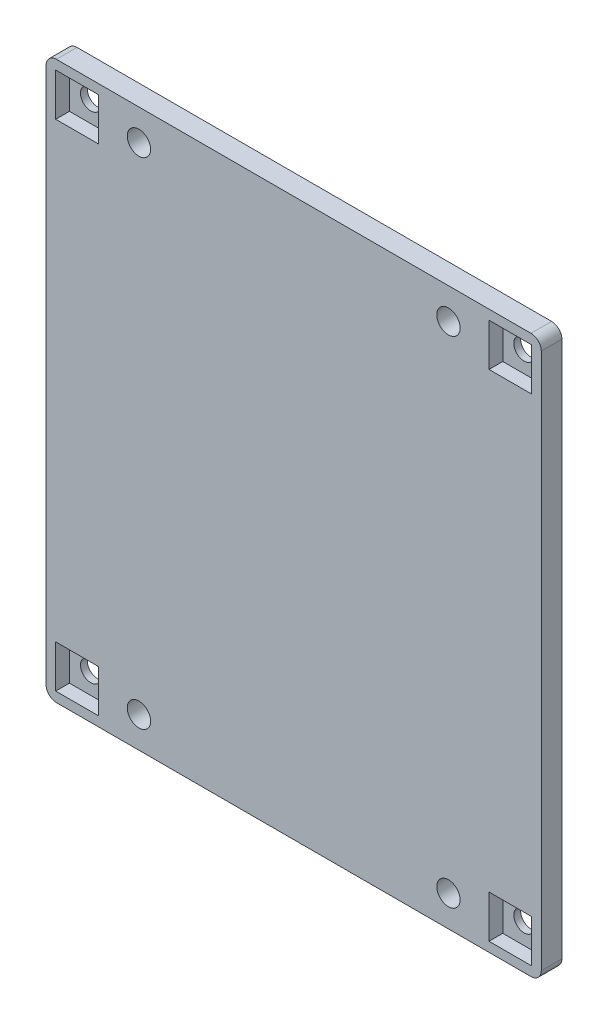
ISO-10303-21;
HEADER;
FILE_DESCRIPTION(('STEP AP214'),'2;1');
FILE_NAME('part.step','',(''),(''),'','','');
FILE_SCHEMA(('AUTOMOTIVE_DESIGN { 1 0 10303 214 1 1 1 1 }'));
ENDSEC;
DATA;
#1=APPLICATION_CONTEXT('core data for automotive mechanical design processes');
#2=APPLICATION_PROTOCOL_DEFINITION('international standard','automotive_design',2000,#1);
#3=PRODUCT_CONTEXT('',#1,'mechanical');
#4=PRODUCT('Part','Part','',(#3));
#5=PRODUCT_RELATED_PRODUCT_CATEGORY('part','',(#4));
#6=PRODUCT_DEFINITION_FORMATION('','',#4);
#7=PRODUCT_DEFINITION_CONTEXT('part definition',#1,'design');
#8=PRODUCT_DEFINITION('design','',#6,#7);
#9=PRODUCT_DEFINITION_SHAPE('','',#8);
#10=(LENGTH_UNIT() NAMED_UNIT(*) SI_UNIT(.MILLI.,.METRE.));
#11=(NAMED_UNIT(*) PLANE_ANGLE_UNIT() SI_UNIT($,.RADIAN.));
#12=(NAMED_UNIT(*) SI_UNIT($,.STERADIAN.) SOLID_ANGLE_UNIT());
#13=UNCERTAINTY_MEASURE_WITH_UNIT(LENGTH_MEASURE(1.E-05),#10,'distance_accuracy_value','');
#14=(GEOMETRIC_REPRESENTATION_CONTEXT(3) GLOBAL_UNCERTAINTY_ASSIGNED_CONTEXT((#13)) GLOBAL_UNIT_ASSIGNED_CONTEXT((#10,
#11,#12)) REPRESENTATION_CONTEXT('',''));
#15=CARTESIAN_POINT('',(0.,0.,0.));
#16=DIRECTION('',(0.,0.,1.));
#17=DIRECTION('',(1.,0.,0.));
#18=AXIS2_PLACEMENT_3D('',#15,#16,#17);
#19=CARTESIAN_POINT('',(73.690098203,224.4095935041,3.));
#20=DIRECTION('',(0.,0.,-1.));
#21=DIRECTION('',(-1.,0.,0.));
#22=AXIS2_PLACEMENT_3D('',#19,#20,#21);
#23=CYLINDRICAL_SURFACE('',#22,1.5);
#24=CARTESIAN_POINT('',(73.690098203,224.4095935041,0.));
#25=DIRECTION('',(0.,0.,1.));
#26=DIRECTION('',(1.,0.,0.));
#27=AXIS2_PLACEMENT_3D('',#24,#25,#26);
#28=CIRCLE('',#27,1.5);
#29=CARTESIAN_POINT('',(75.190098203,224.4095935041,0.));
#30=VERTEX_POINT('',#29);
#31=EDGE_CURVE('E364',#30,#30,#28,.T.);
#32=ORIENTED_EDGE('',*,*,#31,.F.);
#33=EDGE_LOOP('',(#32));
#34=FACE_BOUND('',#33,.T.);
#35=CARTESIAN_POINT('',(73.690098203,224.4095935041,1.));
#36=DIRECTION('',(0.,0.,1.));
#37=DIRECTION('',(1.,0.,0.));
#38=AXIS2_PLACEMENT_3D('',#35,#36,#37);
#39=CIRCLE('',#38,1.5);
#40=CARTESIAN_POINT('',(75.190098203,224.4095935041,1.));
#41=VERTEX_POINT('',#40);
#42=EDGE_CURVE('E259',#41,#41,#39,.T.);
#43=ORIENTED_EDGE('',*,*,#42,.T.);
#44=EDGE_LOOP('',(#43));
#45=FACE_BOUND('',#44,.T.);
#46=ADVANCED_FACE('F33',(#34,#45),#23,.F.);
#47=CARTESIAN_POINT('',(73.690098203,296.4145378641,3.));
#48=DIRECTION('',(0.,0.,-1.));
#49=DIRECTION('',(-1.,0.,0.));
#50=AXIS2_PLACEMENT_3D('',#47,#48,#49);
#51=CYLINDRICAL_SURFACE('',#50,1.5);
#52=CARTESIAN_POINT('',(73.690098203,296.4145378641,0.));
#53=DIRECTION('',(0.,0.,1.));
#54=DIRECTION('',(1.,0.,0.));
#55=AXIS2_PLACEMENT_3D('',#52,#53,#54);
#56=CIRCLE('',#55,1.5);
#57=CARTESIAN_POINT('',(75.190098203,296.4145378641,0.));
#58=VERTEX_POINT('',#57);
#59=EDGE_CURVE('E353',#58,#58,#56,.T.);
#60=ORIENTED_EDGE('',*,*,#59,.F.);
#61=EDGE_LOOP('',(#60));
#62=FACE_BOUND('',#61,.T.);
#63=CARTESIAN_POINT('',(73.690098203,296.4145378641,1.));
#64=DIRECTION('',(0.,0.,1.));
#65=DIRECTION('',(1.,0.,0.));
#66=AXIS2_PLACEMENT_3D('',#63,#64,#65);
#67=CIRCLE('',#66,1.5);
#68=CARTESIAN_POINT('',(75.190098203,296.4145378641,1.));
#69=VERTEX_POINT('',#68);
#70=EDGE_CURVE('E291',#69,#69,#67,.T.);
#71=ORIENTED_EDGE('',*,*,#70,.T.);
#72=EDGE_LOOP('',(#71));
#73=FACE_BOUND('',#72,.T.);
#74=ADVANCED_FACE('F492',(#62,#73),#51,.F.);
#75=CARTESIAN_POINT('',(10.6873594666,296.4145378641,3.));
#76=DIRECTION('',(0.,0.,-1.));
#77=DIRECTION('',(-1.,0.,0.));
#78=AXIS2_PLACEMENT_3D('',#75,#76,#77);
#79=CYLINDRICAL_SURFACE('',#78,1.5);
#80=CARTESIAN_POINT('',(10.6873594666,296.4145378641,0.));
#81=DIRECTION('',(0.,0.,1.));
#82=DIRECTION('',(1.,0.,0.));
#83=AXIS2_PLACEMENT_3D('',#80,#81,#82);
#84=CIRCLE('',#83,1.5);
#85=CARTESIAN_POINT('',(12.1873594666,296.4145378641,0.));
#86=VERTEX_POINT('',#85);
#87=EDGE_CURVE('E361',#86,#86,#84,.T.);
#88=ORIENTED_EDGE('',*,*,#87,.F.);
#89=EDGE_LOOP('',(#88));
#90=FACE_BOUND('',#89,.T.);
#91=CARTESIAN_POINT('',(10.6873594666,296.4145378641,1.));
#92=DIRECTION('',(0.,0.,1.));
#93=DIRECTION('',(1.,0.,0.));
#94=AXIS2_PLACEMENT_3D('',#91,#92,#93);
#95=CIRCLE('',#94,1.5);
#96=CARTESIAN_POINT('',(12.1873594666,296.4145378641,1.));
#97=VERTEX_POINT('',#96);
#98=EDGE_CURVE('E324',#97,#97,#95,.T.);
#99=ORIENTED_EDGE('',*,*,#98,.T.);
#100=EDGE_LOOP('',(#99));
#101=FACE_BOUND('',#100,.T.);
#102=ADVANCED_FACE('F451',(#90,#101),#79,.F.);
#103=CARTESIAN_POINT('',(76.690098203,299.4145378641,3.));
#104=DIRECTION('',(0.,0.,1.));
#105=DIRECTION('',(1.,0.,0.));
#106=AXIS2_PLACEMENT_3D('',#103,#104,#105);
#107=PLANE('',#106);
#108=DIRECTION('',(0.,-1.,0.));
#109=VECTOR('',#108,1.);
#110=CARTESIAN_POINT('',(7.5873594666,227.5095935041,3.));
#111=LINE('',#110,#109);
#112=CARTESIAN_POINT('',(7.5873594666,227.5095935041,3.));
#113=VERTEX_POINT('',#112);
#114=CARTESIAN_POINT('',(7.58735946660001,221.3095935041,3.));
#115=VERTEX_POINT('',#114);
#116=EDGE_CURVE('E50',#113,#115,#111,.T.);
#117=ORIENTED_EDGE('',*,*,#116,.F.);
#118=DIRECTION('',(-1.,0.,0.));
#119=VECTOR('',#118,1.);
#120=CARTESIAN_POINT('',(13.7873594666,227.5095935041,3.));
#121=LINE('',#120,#119);
#122=CARTESIAN_POINT('',(13.7873594666,227.5095935041,3.));
#123=VERTEX_POINT('',#122);
#124=EDGE_CURVE('E216',#123,#113,#121,.T.);
#125=ORIENTED_EDGE('',*,*,#124,.F.);
#126=DIRECTION('',(0.,1.,0.));
#127=VECTOR('',#126,1.);
#128=CARTESIAN_POINT('',(13.7873594666,227.5095935041,3.));
#129=LINE('',#128,#127);
#130=CARTESIAN_POINT('',(13.7873594666,221.3095935041,3.));
#131=VERTEX_POINT('',#130);
#132=EDGE_CURVE('E219',#131,#123,#129,.T.);
#133=ORIENTED_EDGE('',*,*,#132,.F.);
#134=DIRECTION('',(1.,0.,0.));
#135=VECTOR('',#134,1.);
#136=CARTESIAN_POINT('',(13.7873594666,221.3095935041,3.));
#137=LINE('',#136,#135);
#138=EDGE_CURVE('E225',#115,#131,#137,.T.);
#139=ORIENTED_EDGE('',*,*,#138,.F.);
#140=EDGE_LOOP('',(#117,#125,#133,#139));
#141=FACE_BOUND('',#140,.T.);
#142=DIRECTION('',(0.,1.,0.));
#143=VECTOR('',#142,1.);
#144=CARTESIAN_POINT('',(76.790098203,227.5095935041,3.));
#145=LINE('',#144,#143);
#146=CARTESIAN_POINT('',(76.790098203,221.3095935041,3.));
#147=VERTEX_POINT('',#146);
#148=CARTESIAN_POINT('',(76.790098203,227.5095935041,3.));
#149=VERTEX_POINT('',#148);
#150=EDGE_CURVE('E58',#147,#149,#145,.T.);
#151=ORIENTED_EDGE('',*,*,#150,.F.);
#152=DIRECTION('',(1.,0.,0.));
#153=VECTOR('',#152,1.);
#154=CARTESIAN_POINT('',(70.590098203,221.3095935041,3.));
#155=LINE('',#154,#153);
#156=CARTESIAN_POINT('',(70.590098203,221.3095935041,3.));
#157=VERTEX_POINT('',#156);
#158=EDGE_CURVE('E238',#157,#147,#155,.T.);
#159=ORIENTED_EDGE('',*,*,#158,.F.);
#160=DIRECTION('',(0.,-1.,0.));
#161=VECTOR('',#160,1.);
#162=CARTESIAN_POINT('',(70.590098203,227.5095935041,3.));
#163=LINE('',#162,#161);
#164=CARTESIAN_POINT('',(70.590098203,227.5095935041,3.));
#165=VERTEX_POINT('',#164);
#166=EDGE_CURVE('E252',#165,#157,#163,.T.);
#167=ORIENTED_EDGE('',*,*,#166,.F.);
#168=DIRECTION('',(-1.,0.,0.));
#169=VECTOR('',#168,1.);
#170=CARTESIAN_POINT('',(70.590098203,227.5095935041,3.));
#171=LINE('',#170,#169);
#172=EDGE_CURVE('E249',#149,#165,#171,.T.);
#173=ORIENTED_EDGE('',*,*,#172,.F.);
#174=EDGE_LOOP('',(#151,#159,#167,#173));
#175=FACE_BOUND('',#174,.T.);
#176=DIRECTION('',(0.,1.,0.));
#177=VECTOR('',#176,1.);
#178=CARTESIAN_POINT('',(76.790098203,299.5145378641,3.));
#179=LINE('',#178,#177);
#180=CARTESIAN_POINT('',(76.790098203,293.3145378641,3.));
#181=VERTEX_POINT('',#180);
#182=CARTESIAN_POINT('',(76.790098203,299.5145378641,3.));
#183=VERTEX_POINT('',#182);
#184=EDGE_CURVE('E279',#181,#183,#179,.T.);
#185=ORIENTED_EDGE('',*,*,#184,.F.);
#186=DIRECTION('',(1.,0.,0.));
#187=VECTOR('',#186,1.);
#188=CARTESIAN_POINT('',(70.590098203,293.3145378641,3.));
#189=LINE('',#188,#187);
#190=CARTESIAN_POINT('',(70.590098203,293.3145378641,3.));
#191=VERTEX_POINT('',#190);
#192=EDGE_CURVE('E269',#191,#181,#189,.T.);
#193=ORIENTED_EDGE('',*,*,#192,.F.);
#194=DIRECTION('',(0.,-1.,0.));
#195=VECTOR('',#194,1.);
#196=CARTESIAN_POINT('',(70.590098203,299.5145378641,3.));
#197=LINE('',#196,#195);
#198=CARTESIAN_POINT('',(70.590098203,299.5145378641,3.));
#199=VERTEX_POINT('',#198);
#200=EDGE_CURVE('E284',#199,#191,#197,.T.);
#201=ORIENTED_EDGE('',*,*,#200,.F.);
#202=DIRECTION('',(-1.,0.,0.));
#203=VECTOR('',#202,1.);
#204=CARTESIAN_POINT('',(70.590098203,299.5145378641,3.));
#205=LINE('',#204,#203);
#206=EDGE_CURVE('E281',#183,#199,#205,.T.);
#207=ORIENTED_EDGE('',*,*,#206,.F.);
#208=EDGE_LOOP('',(#185,#193,#201,#207));
#209=FACE_BOUND('',#208,.T.);
#210=DIRECTION('',(0.,1.,0.));
#211=VECTOR('',#210,1.);
#212=CARTESIAN_POINT('',(13.7873594666,299.5145378641,3.));
#213=LINE('',#212,#211);
#214=CARTESIAN_POINT('',(13.7873594666,293.3145378641,3.));
#215=VERTEX_POINT('',#214);
#216=CARTESIAN_POINT('',(13.7873594666,299.5145378641,3.));
#217=VERTEX_POINT('',#216);
#218=EDGE_CURVE('E312',#215,#217,#213,.T.);
#219=ORIENTED_EDGE('',*,*,#218,.F.);
#220=DIRECTION('',(1.,0.,0.));
#221=VECTOR('',#220,1.);
#222=CARTESIAN_POINT('',(7.58735946660001,293.3145378641,3.));
#223=LINE('',#222,#221);
#224=CARTESIAN_POINT('',(7.58735946660001,293.3145378641,3.));
#225=VERTEX_POINT('',#224);
#226=EDGE_CURVE('E302',#225,#215,#223,.T.);
#227=ORIENTED_EDGE('',*,*,#226,.F.);
#228=DIRECTION('',(0.,-1.,0.));
#229=VECTOR('',#228,1.);
#230=CARTESIAN_POINT('',(7.58735946660001,299.5145378641,3.));
#231=LINE('',#230,#229);
#232=CARTESIAN_POINT('',(7.58735946660001,299.5145378641,3.));
#233=VERTEX_POINT('',#232);
#234=EDGE_CURVE('E317',#233,#225,#231,.T.);
#235=ORIENTED_EDGE('',*,*,#234,.F.);
#236=DIRECTION('',(-1.,0.,0.));
#237=VECTOR('',#236,1.);
#238=CARTESIAN_POINT('',(7.58735946660001,299.5145378641,3.));
#239=LINE('',#238,#237);
#240=EDGE_CURVE('E314',#217,#233,#239,.T.);
#241=ORIENTED_EDGE('',*,*,#240,.F.);
#242=EDGE_LOOP('',(#219,#227,#235,#241));
#243=FACE_BOUND('',#242,.T.);
#244=CARTESIAN_POINT('',(19.6870249644,224.4095935041,3.));
#245=DIRECTION('',(0.,0.,1.));
#246=DIRECTION('',(1.,0.,0.));
#247=AXIS2_PLACEMENT_3D('',#244,#245,#246);
#248=CIRCLE('',#247,1.7);
#249=CARTESIAN_POINT('',(21.3870249644,224.4095935041,3.));
#250=VERTEX_POINT('',#249);
#251=EDGE_CURVE('E338',#250,#250,#248,.T.);
#252=ORIENTED_EDGE('',*,*,#251,.F.);
#253=EDGE_LOOP('',(#252));
#254=FACE_BOUND('',#253,.T.);
#255=CARTESIAN_POINT('',(19.6870249644,296.4145378641,3.));
#256=DIRECTION('',(0.,0.,1.));
#257=DIRECTION('',(1.,0.,0.));
#258=AXIS2_PLACEMENT_3D('',#255,#256,#257);
#259=CIRCLE('',#258,1.7);
#260=CARTESIAN_POINT('',(21.3870249644,296.4145378641,3.));
#261=VERTEX_POINT('',#260);
#262=EDGE_CURVE('E350',#261,#261,#259,.T.);
#263=ORIENTED_EDGE('',*,*,#262,.F.);
#264=EDGE_LOOP('',(#263));
#265=FACE_BOUND('',#264,.T.);
#266=CARTESIAN_POINT('',(76.690098203,299.4145378641,3.));
#267=DIRECTION('',(0.,0.,1.));
#268=DIRECTION('',(1.,0.,0.));
#269=AXIS2_PLACEMENT_3D('',#266,#267,#268);
#270=CIRCLE('',#269,1.5);
#271=CARTESIAN_POINT('',(78.190098203,299.4145378641,3.));
#272=VERTEX_POINT('',#271);
#273=CARTESIAN_POINT('',(76.690098203,300.9145378641,3.));
#274=VERTEX_POINT('',#273);
#275=EDGE_CURVE('E368',#272,#274,#270,.T.);
#276=ORIENTED_EDGE('',*,*,#275,.T.);
#277=DIRECTION('',(-1.,0.,0.));
#278=VECTOR('',#277,1.);
#279=CARTESIAN_POINT('',(7.6876939687,300.9145378641,3.));
#280=LINE('',#279,#278);
#281=CARTESIAN_POINT('',(7.6876939687,300.9145378641,3.));
#282=VERTEX_POINT('',#281);
#283=EDGE_CURVE('E371',#274,#282,#280,.T.);
#284=ORIENTED_EDGE('',*,*,#283,.T.);
#285=CARTESIAN_POINT('',(7.6876939687,299.4145378641,3.));
#286=DIRECTION('',(0.,0.,1.));
#287=DIRECTION('',(1.,0.,0.));
#288=AXIS2_PLACEMENT_3D('',#285,#286,#287);
#289=CIRCLE('',#288,1.5);
#290=CARTESIAN_POINT('',(6.1876939687,299.4145378641,3.));
#291=VERTEX_POINT('',#290);
#292=EDGE_CURVE('E374',#282,#291,#289,.T.);
#293=ORIENTED_EDGE('',*,*,#292,.T.);
#294=DIRECTION('',(0.,-1.,0.));
#295=VECTOR('',#294,1.);
#296=CARTESIAN_POINT('',(6.1876939687,221.4099280063,3.));
#297=LINE('',#296,#295);
#298=CARTESIAN_POINT('',(6.1876939687,221.4099280063,3.));
#299=VERTEX_POINT('',#298);
#300=EDGE_CURVE('E376',#291,#299,#297,.T.);
#301=ORIENTED_EDGE('',*,*,#300,.T.);
#302=CARTESIAN_POINT('',(7.6876939687,221.4099280063,3.));
#303=DIRECTION('',(0.,0.,1.));
#304=DIRECTION('',(1.,0.,0.));
#305=AXIS2_PLACEMENT_3D('',#302,#303,#304);
#306=CIRCLE('',#305,1.5);
#307=CARTESIAN_POINT('',(7.6876939687,219.9099280063,3.));
#308=VERTEX_POINT('',#307);
#309=EDGE_CURVE('E378',#299,#308,#306,.T.);
#310=ORIENTED_EDGE('',*,*,#309,.T.);
#311=DIRECTION('',(1.,0.,0.));
#312=VECTOR('',#311,1.);
#313=CARTESIAN_POINT('',(76.690098203,219.9099280063,3.));
#314=LINE('',#313,#312);
#315=CARTESIAN_POINT('',(76.690098203,219.9099280063,3.));
#316=VERTEX_POINT('',#315);
#317=EDGE_CURVE('E380',#308,#316,#314,.T.);
#318=ORIENTED_EDGE('',*,*,#317,.T.);
#319=CARTESIAN_POINT('',(76.690098203,221.4099280063,3.));
#320=DIRECTION('',(0.,0.,1.));
#321=DIRECTION('',(1.,0.,0.));
#322=AXIS2_PLACEMENT_3D('',#319,#320,#321);
#323=CIRCLE('',#322,1.5);
#324=CARTESIAN_POINT('',(78.190098203,221.4099280063,3.));
#325=VERTEX_POINT('',#324);
#326=EDGE_CURVE('E382',#316,#325,#323,.T.);
#327=ORIENTED_EDGE('',*,*,#326,.T.);
#328=DIRECTION('',(0.,1.,0.));
#329=VECTOR('',#328,1.);
#330=CARTESIAN_POINT('',(78.190098203,299.4145378641,3.));
#331=LINE('',#330,#329);
#332=EDGE_CURVE('E384',#325,#272,#331,.T.);
#333=ORIENTED_EDGE('',*,*,#332,.T.);
#334=EDGE_LOOP('',(#276,#284,#293,#301,#310,#318,#327,#333));
#335=FACE_BOUND('',#334,.T.);
#336=CARTESIAN_POINT('',(64.6904327051,296.4145378641,3.));
#337=DIRECTION('',(0.,0.,1.));
#338=DIRECTION('',(1.,0.,0.));
#339=AXIS2_PLACEMENT_3D('',#336,#337,#338);
#340=CIRCLE('',#339,1.69999999999999);
#341=CARTESIAN_POINT('',(66.3904327051,296.4145378641,3.));
#342=VERTEX_POINT('',#341);
#343=EDGE_CURVE('E344',#342,#342,#340,.T.);
#344=ORIENTED_EDGE('',*,*,#343,.F.);
#345=EDGE_LOOP('',(#344));
#346=FACE_BOUND('',#345,.T.);
#347=CARTESIAN_POINT('',(64.6904327051,224.4095935041,3.));
#348=DIRECTION('',(0.,0.,1.));
#349=DIRECTION('',(1.,0.,0.));
#350=AXIS2_PLACEMENT_3D('',#347,#348,#349);
#351=CIRCLE('',#350,1.69999999999999);
#352=CARTESIAN_POINT('',(66.3904327051,224.4095935041,3.));
#353=VERTEX_POINT('',#352);
#354=EDGE_CURVE('E331',#353,#353,#351,.T.);
#355=ORIENTED_EDGE('',*,*,#354,.F.);
#356=EDGE_LOOP('',(#355));
#357=FACE_BOUND('',#356,.T.);
#358=ADVANCED_FACE('F447',(#141,#175,#209,#243,#254,#265,#335,#346,#357),#107,.T.);
#359=CARTESIAN_POINT('',(76.690098203,299.4145378641,0.));
#360=DIRECTION('',(0.,0.,1.));
#361=DIRECTION('',(1.,0.,0.));
#362=AXIS2_PLACEMENT_3D('',#359,#360,#361);
#363=PLANE('',#362);
#364=CARTESIAN_POINT('',(19.6870249644,224.4095935041,0.));
#365=DIRECTION('',(0.,0.,1.));
#366=DIRECTION('',(1.,0.,0.));
#367=AXIS2_PLACEMENT_3D('',#364,#365,#366);
#368=CIRCLE('',#367,1.7);
#369=CARTESIAN_POINT('',(21.3870249644,224.4095935041,0.));
#370=VERTEX_POINT('',#369);
#371=EDGE_CURVE('E334',#370,#370,#368,.T.);
#372=ORIENTED_EDGE('',*,*,#371,.T.);
#373=EDGE_LOOP('',(#372));
#374=FACE_BOUND('',#373,.T.);
#375=CARTESIAN_POINT('',(19.6870249644,296.4145378641,0.));
#376=DIRECTION('',(0.,0.,1.));
#377=DIRECTION('',(1.,0.,0.));
#378=AXIS2_PLACEMENT_3D('',#375,#376,#377);
#379=CIRCLE('',#378,1.7);
#380=CARTESIAN_POINT('',(21.3870249644,296.4145378641,0.));
#381=VERTEX_POINT('',#380);
#382=EDGE_CURVE('E347',#381,#381,#379,.T.);
#383=ORIENTED_EDGE('',*,*,#382,.T.);
#384=EDGE_LOOP('',(#383));
#385=FACE_BOUND('',#384,.T.);
#386=CARTESIAN_POINT('',(10.6873594666,224.4095935041,0.));
#387=DIRECTION('',(0.,0.,1.));
#388=DIRECTION('',(1.,0.,0.));
#389=AXIS2_PLACEMENT_3D('',#386,#387,#388);
#390=CIRCLE('',#389,1.5);
#391=CARTESIAN_POINT('',(12.1873594666,224.4095935041,0.));
#392=VERTEX_POINT('',#391);
#393=EDGE_CURVE('E358',#392,#392,#390,.T.);
#394=ORIENTED_EDGE('',*,*,#393,.T.);
#395=EDGE_LOOP('',(#394));
#396=FACE_BOUND('',#395,.T.);
#397=ORIENTED_EDGE('',*,*,#31,.T.);
#398=EDGE_LOOP('',(#397));
#399=FACE_BOUND('',#398,.T.);
#400=CARTESIAN_POINT('',(76.690098203,299.4145378641,0.));
#401=DIRECTION('',(0.,0.,1.));
#402=DIRECTION('',(1.,0.,0.));
#403=AXIS2_PLACEMENT_3D('',#400,#401,#402);
#404=CIRCLE('',#403,1.5);
#405=CARTESIAN_POINT('',(78.190098203,299.4145378641,0.));
#406=VERTEX_POINT('',#405);
#407=CARTESIAN_POINT('',(76.690098203,300.9145378641,0.));
#408=VERTEX_POINT('',#407);
#409=EDGE_CURVE('E367',#406,#408,#404,.T.);
#410=ORIENTED_EDGE('',*,*,#409,.F.);
#411=DIRECTION('',(0.,1.,0.));
#412=VECTOR('',#411,1.);
#413=CARTESIAN_POINT('',(78.190098203,299.4145378641,0.));
#414=LINE('',#413,#412);
#415=CARTESIAN_POINT('',(78.190098203,221.4099280063,0.));
#416=VERTEX_POINT('',#415);
#417=EDGE_CURVE('E372',#416,#406,#414,.T.);
#418=ORIENTED_EDGE('',*,*,#417,.F.);
#419=CARTESIAN_POINT('',(76.690098203,221.4099280063,0.));
#420=DIRECTION('',(0.,0.,1.));
#421=DIRECTION('',(1.,0.,0.));
#422=AXIS2_PLACEMENT_3D('',#419,#420,#421);
#423=CIRCLE('',#422,1.5);
#424=CARTESIAN_POINT('',(76.690098203,219.9099280063,0.));
#425=VERTEX_POINT('',#424);
#426=EDGE_CURVE('E399',#425,#416,#423,.T.);
#427=ORIENTED_EDGE('',*,*,#426,.F.);
#428=DIRECTION('',(1.,0.,0.));
#429=VECTOR('',#428,1.);
#430=CARTESIAN_POINT('',(76.690098203,219.9099280063,0.));
#431=LINE('',#430,#429);
#432=CARTESIAN_POINT('',(7.6876939687,219.9099280063,0.));
#433=VERTEX_POINT('',#432);
#434=EDGE_CURVE('E397',#433,#425,#431,.T.);
#435=ORIENTED_EDGE('',*,*,#434,.F.);
#436=CARTESIAN_POINT('',(7.6876939687,221.4099280063,0.));
#437=DIRECTION('',(0.,0.,1.));
#438=DIRECTION('',(1.,0.,0.));
#439=AXIS2_PLACEMENT_3D('',#436,#437,#438);
#440=CIRCLE('',#439,1.5);
#441=CARTESIAN_POINT('',(6.1876939687,221.4099280063,0.));
#442=VERTEX_POINT('',#441);
#443=EDGE_CURVE('E395',#442,#433,#440,.T.);
#444=ORIENTED_EDGE('',*,*,#443,.F.);
#445=DIRECTION('',(0.,-1.,0.));
#446=VECTOR('',#445,1.);
#447=CARTESIAN_POINT('',(6.1876939687,221.4099280063,0.));
#448=LINE('',#447,#446);
#449=CARTESIAN_POINT('',(6.1876939687,299.4145378641,0.));
#450=VERTEX_POINT('',#449);
#451=EDGE_CURVE('E393',#450,#442,#448,.T.);
#452=ORIENTED_EDGE('',*,*,#451,.F.);
#453=CARTESIAN_POINT('',(7.6876939687,299.4145378641,0.));
#454=DIRECTION('',(0.,0.,1.));
#455=DIRECTION('',(1.,0.,0.));
#456=AXIS2_PLACEMENT_3D('',#453,#454,#455);
#457=CIRCLE('',#456,1.5);
#458=CARTESIAN_POINT('',(7.6876939687,300.9145378641,0.));
#459=VERTEX_POINT('',#458);
#460=EDGE_CURVE('E391',#459,#450,#457,.T.);
#461=ORIENTED_EDGE('',*,*,#460,.F.);
#462=DIRECTION('',(-1.,0.,0.));
#463=VECTOR('',#462,1.);
#464=CARTESIAN_POINT('',(7.6876939687,300.9145378641,0.));
#465=LINE('',#464,#463);
#466=EDGE_CURVE('E389',#408,#459,#465,.T.);
#467=ORIENTED_EDGE('',*,*,#466,.F.);
#468=EDGE_LOOP('',(#410,#418,#427,#435,#444,#452,#461,#467));
#469=FACE_BOUND('',#468,.T.);
#470=ORIENTED_EDGE('',*,*,#87,.T.);
#471=EDGE_LOOP('',(#470));
#472=FACE_BOUND('',#471,.T.);
#473=ORIENTED_EDGE('',*,*,#59,.T.);
#474=EDGE_LOOP('',(#473));
#475=FACE_BOUND('',#474,.T.);
#476=CARTESIAN_POINT('',(64.6904327051,296.4145378641,0.));
#477=DIRECTION('',(0.,0.,1.));
#478=DIRECTION('',(1.,0.,0.));
#479=AXIS2_PLACEMENT_3D('',#476,#477,#478);
#480=CIRCLE('',#479,1.69999999999999);
#481=CARTESIAN_POINT('',(66.3904327051,296.4145378641,0.));
#482=VERTEX_POINT('',#481);
#483=EDGE_CURVE('E341',#482,#482,#480,.T.);
#484=ORIENTED_EDGE('',*,*,#483,.T.);
#485=EDGE_LOOP('',(#484));
#486=FACE_BOUND('',#485,.T.);
#487=CARTESIAN_POINT('',(64.6904327051,224.4095935041,0.));
#488=DIRECTION('',(0.,0.,1.));
#489=DIRECTION('',(1.,0.,0.));
#490=AXIS2_PLACEMENT_3D('',#487,#488,#489);
#491=CIRCLE('',#490,1.69999999999999);
#492=CARTESIAN_POINT('',(66.3904327051,224.4095935041,0.));
#493=VERTEX_POINT('',#492);
#494=EDGE_CURVE('E335',#493,#493,#491,.T.);
#495=ORIENTED_EDGE('',*,*,#494,.T.);
#496=EDGE_LOOP('',(#495));
#497=FACE_BOUND('',#496,.T.);
#498=ADVANCED_FACE('F450',(#374,#385,#396,#399,#469,#472,#475,#486,#497),#363,.F.);
#499=CARTESIAN_POINT('',(76.690098203,299.4145378641,3.));
#500=DIRECTION('',(0.,0.,-1.));
#501=DIRECTION('',(-1.,0.,0.));
#502=AXIS2_PLACEMENT_3D('',#499,#500,#501);
#503=CYLINDRICAL_SURFACE('',#502,1.5);
#504=ORIENTED_EDGE('',*,*,#409,.T.);
#505=DIRECTION('',(0.,0.,-1.));
#506=VECTOR('',#505,1.);
#507=CARTESIAN_POINT('',(76.690098203,300.9145378641,3.));
#508=LINE('',#507,#506);
#509=EDGE_CURVE('E11',#274,#408,#508,.T.);
#510=ORIENTED_EDGE('',*,*,#509,.F.);
#511=ORIENTED_EDGE('',*,*,#275,.F.);
#512=DIRECTION('',(0.,0.,-1.));
#513=VECTOR('',#512,1.);
#514=CARTESIAN_POINT('',(78.190098203,299.4145378641,3.));
#515=LINE('',#514,#513);
#516=EDGE_CURVE('E386',#272,#406,#515,.T.);
#517=ORIENTED_EDGE('',*,*,#516,.T.);
#518=EDGE_LOOP('',(#504,#510,#511,#517));
#519=FACE_BOUND('',#518,.T.);
#520=ADVANCED_FACE('F35',(#519),#503,.T.);
#521=CARTESIAN_POINT('',(7.6876939687,300.9145378641,3.));
#522=DIRECTION('',(0.,-1.,0.));
#523=DIRECTION('',(0.,0.,-1.));
#524=AXIS2_PLACEMENT_3D('',#521,#522,#523);
#525=PLANE('',#524);
#526=ORIENTED_EDGE('',*,*,#466,.T.);
#527=DIRECTION('',(0.,0.,-1.));
#528=VECTOR('',#527,1.);
#529=CARTESIAN_POINT('',(7.6876939687,300.9145378641,3.));
#530=LINE('',#529,#528);
#531=EDGE_CURVE('E42',#282,#459,#530,.T.);
#532=ORIENTED_EDGE('',*,*,#531,.F.);
#533=ORIENTED_EDGE('',*,*,#283,.F.);
#534=ORIENTED_EDGE('',*,*,#509,.T.);
#535=EDGE_LOOP('',(#526,#532,#533,#534));
#536=FACE_BOUND('',#535,.T.);
#537=ADVANCED_FACE('F487',(#536),#525,.F.);
#538=CARTESIAN_POINT('',(7.6876939687,299.4145378641,3.));
#539=DIRECTION('',(0.,0.,-1.));
#540=DIRECTION('',(-1.,0.,0.));
#541=AXIS2_PLACEMENT_3D('',#538,#539,#540);
#542=CYLINDRICAL_SURFACE('',#541,1.5);
#543=ORIENTED_EDGE('',*,*,#460,.T.);
#544=DIRECTION('',(0.,0.,-1.));
#545=VECTOR('',#544,1.);
#546=CARTESIAN_POINT('',(6.1876939687,299.4145378641,3.));
#547=LINE('',#546,#545);
#548=EDGE_CURVE('E416',#291,#450,#547,.T.);
#549=ORIENTED_EDGE('',*,*,#548,.F.);
#550=ORIENTED_EDGE('',*,*,#292,.F.);
#551=ORIENTED_EDGE('',*,*,#531,.T.);
#552=EDGE_LOOP('',(#543,#549,#550,#551));
#553=FACE_BOUND('',#552,.T.);
#554=ADVANCED_FACE('F642',(#553),#542,.T.);
#555=CARTESIAN_POINT('',(6.1876939687,221.4099280063,3.));
#556=DIRECTION('',(1.,0.,0.));
#557=DIRECTION('',(0.,0.,-1.));
#558=AXIS2_PLACEMENT_3D('',#555,#556,#557);
#559=PLANE('',#558);
#560=ORIENTED_EDGE('',*,*,#451,.T.);
#561=DIRECTION('',(0.,0.,-1.));
#562=VECTOR('',#561,1.);
#563=CARTESIAN_POINT('',(6.1876939687,221.4099280063,3.));
#564=LINE('',#563,#562);
#565=EDGE_CURVE('E413',#299,#442,#564,.T.);
#566=ORIENTED_EDGE('',*,*,#565,.F.);
#567=ORIENTED_EDGE('',*,*,#300,.F.);
#568=ORIENTED_EDGE('',*,*,#548,.T.);
#569=EDGE_LOOP('',(#560,#566,#567,#568));
#570=FACE_BOUND('',#569,.T.);
#571=ADVANCED_FACE('F639',(#570),#559,.F.);
#572=CARTESIAN_POINT('',(7.6876939687,221.4099280063,3.));
#573=DIRECTION('',(0.,0.,-1.));
#574=DIRECTION('',(-1.,0.,0.));
#575=AXIS2_PLACEMENT_3D('',#572,#573,#574);
#576=CYLINDRICAL_SURFACE('',#575,1.5);
#577=ORIENTED_EDGE('',*,*,#443,.T.);
#578=DIRECTION('',(0.,0.,-1.));
#579=VECTOR('',#578,1.);
#580=CARTESIAN_POINT('',(7.6876939687,219.9099280063,3.));
#581=LINE('',#580,#579);
#582=EDGE_CURVE('E410',#308,#433,#581,.T.);
#583=ORIENTED_EDGE('',*,*,#582,.F.);
#584=ORIENTED_EDGE('',*,*,#309,.F.);
#585=ORIENTED_EDGE('',*,*,#565,.T.);
#586=EDGE_LOOP('',(#577,#583,#584,#585));
#587=FACE_BOUND('',#586,.T.);
#588=ADVANCED_FACE('F635',(#587),#576,.T.);
#589=CARTESIAN_POINT('',(76.690098203,219.9099280063,3.));
#590=DIRECTION('',(0.,1.,0.));
#591=DIRECTION('',(0.,0.,1.));
#592=AXIS2_PLACEMENT_3D('',#589,#590,#591);
#593=PLANE('',#592);
#594=ORIENTED_EDGE('',*,*,#434,.T.);
#595=DIRECTION('',(0.,0.,-1.));
#596=VECTOR('',#595,1.);
#597=CARTESIAN_POINT('',(76.690098203,219.9099280063,3.));
#598=LINE('',#597,#596);
#599=EDGE_CURVE('E407',#316,#425,#598,.T.);
#600=ORIENTED_EDGE('',*,*,#599,.F.);
#601=ORIENTED_EDGE('',*,*,#317,.F.);
#602=ORIENTED_EDGE('',*,*,#582,.T.);
#603=EDGE_LOOP('',(#594,#600,#601,#602));
#604=FACE_BOUND('',#603,.T.);
#605=ADVANCED_FACE('F630',(#604),#593,.F.);
#606=CARTESIAN_POINT('',(76.690098203,221.4099280063,3.));
#607=DIRECTION('',(0.,0.,-1.));
#608=DIRECTION('',(-1.,0.,0.));
#609=AXIS2_PLACEMENT_3D('',#606,#607,#608);
#610=CYLINDRICAL_SURFACE('',#609,1.5);
#611=ORIENTED_EDGE('',*,*,#426,.T.);
#612=DIRECTION('',(0.,0.,-1.));
#613=VECTOR('',#612,1.);
#614=CARTESIAN_POINT('',(78.190098203,221.4099280063,3.));
#615=LINE('',#614,#613);
#616=EDGE_CURVE('E404',#325,#416,#615,.T.);
#617=ORIENTED_EDGE('',*,*,#616,.F.);
#618=ORIENTED_EDGE('',*,*,#326,.F.);
#619=ORIENTED_EDGE('',*,*,#599,.T.);
#620=EDGE_LOOP('',(#611,#617,#618,#619));
#621=FACE_BOUND('',#620,.T.);
#622=ADVANCED_FACE('F624',(#621),#610,.T.);
#623=CARTESIAN_POINT('',(78.190098203,299.4145378641,3.));
#624=DIRECTION('',(-1.,0.,0.));
#625=DIRECTION('',(0.,0.,1.));
#626=AXIS2_PLACEMENT_3D('',#623,#624,#625);
#627=PLANE('',#626);
#628=ORIENTED_EDGE('',*,*,#417,.T.);
#629=ORIENTED_EDGE('',*,*,#516,.F.);
#630=ORIENTED_EDGE('',*,*,#332,.F.);
#631=ORIENTED_EDGE('',*,*,#616,.T.);
#632=EDGE_LOOP('',(#628,#629,#630,#631));
#633=FACE_BOUND('',#632,.T.);
#634=ADVANCED_FACE('F508',(#633),#627,.F.);
#635=CARTESIAN_POINT('',(10.6873594666,224.4095935041,3.));
#636=DIRECTION('',(0.,0.,-1.));
#637=DIRECTION('',(-1.,0.,0.));
#638=AXIS2_PLACEMENT_3D('',#635,#636,#637);
#639=CYLINDRICAL_SURFACE('',#638,1.5);
#640=CARTESIAN_POINT('',(10.6873594666,224.4095935041,1.));
#641=DIRECTION('',(0.,0.,-1.));
#642=DIRECTION('',(-1.,0.,0.));
#643=AXIS2_PLACEMENT_3D('',#640,#641,#642);
#644=CIRCLE('',#643,1.5);
#645=CARTESIAN_POINT('',(9.1873594666,224.4095935041,1.));
#646=VERTEX_POINT('',#645);
#647=EDGE_CURVE('E37',#646,#646,#644,.T.);
#648=ORIENTED_EDGE('',*,*,#647,.F.);
#649=EDGE_LOOP('',(#648));
#650=FACE_BOUND('',#649,.T.);
#651=ORIENTED_EDGE('',*,*,#393,.F.);
#652=EDGE_LOOP('',(#651));
#653=FACE_BOUND('',#652,.T.);
#654=ADVANCED_FACE('F505',(#650,#653),#639,.F.);
#655=CARTESIAN_POINT('',(19.6870249644,296.4145378641,3.));
#656=DIRECTION('',(0.,0.,-1.));
#657=DIRECTION('',(-1.,0.,0.));
#658=AXIS2_PLACEMENT_3D('',#655,#656,#657);
#659=CYLINDRICAL_SURFACE('',#658,1.7);
#660=ORIENTED_EDGE('',*,*,#262,.T.);
#661=EDGE_LOOP('',(#660));
#662=FACE_BOUND('',#661,.T.);
#663=ORIENTED_EDGE('',*,*,#382,.F.);
#664=EDGE_LOOP('',(#663));
#665=FACE_BOUND('',#664,.T.);
#666=ADVANCED_FACE('F507',(#662,#665),#659,.F.);
#667=CARTESIAN_POINT('',(64.6904327051,296.4145378641,3.));
#668=DIRECTION('',(0.,0.,-1.));
#669=DIRECTION('',(-1.,0.,0.));
#670=AXIS2_PLACEMENT_3D('',#667,#668,#669);
#671=CYLINDRICAL_SURFACE('',#670,1.69999999999999);
#672=ORIENTED_EDGE('',*,*,#343,.T.);
#673=EDGE_LOOP('',(#672));
#674=FACE_BOUND('',#673,.T.);
#675=ORIENTED_EDGE('',*,*,#483,.F.);
#676=EDGE_LOOP('',(#675));
#677=FACE_BOUND('',#676,.T.);
#678=ADVANCED_FACE('F513',(#674,#677),#671,.F.);
#679=CARTESIAN_POINT('',(19.6870249644,224.4095935041,3.));
#680=DIRECTION('',(0.,0.,-1.));
#681=DIRECTION('',(-1.,0.,0.));
#682=AXIS2_PLACEMENT_3D('',#679,#680,#681);
#683=CYLINDRICAL_SURFACE('',#682,1.7);
#684=ORIENTED_EDGE('',*,*,#251,.T.);
#685=EDGE_LOOP('',(#684));
#686=FACE_BOUND('',#685,.T.);
#687=ORIENTED_EDGE('',*,*,#371,.F.);
#688=EDGE_LOOP('',(#687));
#689=FACE_BOUND('',#688,.T.);
#690=ADVANCED_FACE('F477',(#686,#689),#683,.F.);
#691=CARTESIAN_POINT('',(64.6904327051,224.4095935041,3.));
#692=DIRECTION('',(0.,0.,-1.));
#693=DIRECTION('',(-1.,0.,0.));
#694=AXIS2_PLACEMENT_3D('',#691,#692,#693);
#695=CYLINDRICAL_SURFACE('',#694,1.69999999999999);
#696=ORIENTED_EDGE('',*,*,#354,.T.);
#697=EDGE_LOOP('',(#696));
#698=FACE_BOUND('',#697,.T.);
#699=ORIENTED_EDGE('',*,*,#494,.F.);
#700=EDGE_LOOP('',(#699));
#701=FACE_BOUND('',#700,.T.);
#702=ADVANCED_FACE('F473',(#698,#701),#695,.F.);
#703=CARTESIAN_POINT('',(13.7873594666,299.5145378641,1.));
#704=DIRECTION('',(1.,0.,0.));
#705=DIRECTION('',(0.,0.,-1.));
#706=AXIS2_PLACEMENT_3D('',#703,#704,#705);
#707=PLANE('',#706);
#708=ORIENTED_EDGE('',*,*,#218,.T.);
#709=DIRECTION('',(0.,0.,1.));
#710=VECTOR('',#709,1.);
#711=CARTESIAN_POINT('',(13.7873594666,299.5145378641,1.));
#712=LINE('',#711,#710);
#713=CARTESIAN_POINT('',(13.7873594666,299.5145378641,1.));
#714=VERTEX_POINT('',#713);
#715=EDGE_CURVE('E311',#714,#217,#712,.T.);
#716=ORIENTED_EDGE('',*,*,#715,.F.);
#717=DIRECTION('',(0.,1.,0.));
#718=VECTOR('',#717,1.);
#719=CARTESIAN_POINT('',(13.7873594666,299.5145378641,1.));
#720=LINE('',#719,#718);
#721=CARTESIAN_POINT('',(13.7873594666,293.3145378641,1.));
#722=VERTEX_POINT('',#721);
#723=EDGE_CURVE('E298',#722,#714,#720,.T.);
#724=ORIENTED_EDGE('',*,*,#723,.F.);
#725=DIRECTION('',(0.,0.,1.));
#726=VECTOR('',#725,1.);
#727=CARTESIAN_POINT('',(13.7873594666,293.3145378641,1.));
#728=LINE('',#727,#726);
#729=EDGE_CURVE('E322',#722,#215,#728,.T.);
#730=ORIENTED_EDGE('',*,*,#729,.T.);
#731=EDGE_LOOP('',(#708,#716,#724,#730));
#732=FACE_BOUND('',#731,.T.);
#733=ADVANCED_FACE('F476',(#732),#707,.F.);
#734=CARTESIAN_POINT('',(7.58735946660001,293.3145378641,1.));
#735=DIRECTION('',(0.,-1.,0.));
#736=DIRECTION('',(0.,0.,-1.));
#737=AXIS2_PLACEMENT_3D('',#734,#735,#736);
#738=PLANE('',#737);
#739=ORIENTED_EDGE('',*,*,#226,.T.);
#740=ORIENTED_EDGE('',*,*,#729,.F.);
#741=DIRECTION('',(1.,0.,0.));
#742=VECTOR('',#741,1.);
#743=CARTESIAN_POINT('',(7.58735946660001,293.3145378641,1.));
#744=LINE('',#743,#742);
#745=CARTESIAN_POINT('',(7.58735946660001,293.3145378641,1.));
#746=VERTEX_POINT('',#745);
#747=EDGE_CURVE('E308',#746,#722,#744,.T.);
#748=ORIENTED_EDGE('',*,*,#747,.F.);
#749=DIRECTION('',(0.,0.,1.));
#750=VECTOR('',#749,1.);
#751=CARTESIAN_POINT('',(7.58735946660001,293.3145378641,1.));
#752=LINE('',#751,#750);
#753=EDGE_CURVE('E325',#746,#225,#752,.T.);
#754=ORIENTED_EDGE('',*,*,#753,.T.);
#755=EDGE_LOOP('',(#739,#740,#748,#754));
#756=FACE_BOUND('',#755,.T.);
#757=ADVANCED_FACE('F523',(#756),#738,.F.);
#758=CARTESIAN_POINT('',(7.58735946660001,299.5145378641,1.));
#759=DIRECTION('',(-1.,0.,0.));
#760=DIRECTION('',(0.,0.,1.));
#761=AXIS2_PLACEMENT_3D('',#758,#759,#760);
#762=PLANE('',#761);
#763=ORIENTED_EDGE('',*,*,#234,.T.);
#764=ORIENTED_EDGE('',*,*,#753,.F.);
#765=DIRECTION('',(0.,-1.,0.));
#766=VECTOR('',#765,1.);
#767=CARTESIAN_POINT('',(7.58735946660001,299.5145378641,1.));
#768=LINE('',#767,#766);
#769=CARTESIAN_POINT('',(7.58735946660001,299.5145378641,1.));
#770=VERTEX_POINT('',#769);
#771=EDGE_CURVE('E305',#770,#746,#768,.T.);
#772=ORIENTED_EDGE('',*,*,#771,.F.);
#773=DIRECTION('',(0.,0.,1.));
#774=VECTOR('',#773,1.);
#775=CARTESIAN_POINT('',(7.58735946660001,299.5145378641,1.));
#776=LINE('',#775,#774);
#777=EDGE_CURVE('E327',#770,#233,#776,.T.);
#778=ORIENTED_EDGE('',*,*,#777,.T.);
#779=EDGE_LOOP('',(#763,#764,#772,#778));
#780=FACE_BOUND('',#779,.T.);
#781=ADVANCED_FACE('F529',(#780),#762,.F.);
#782=CARTESIAN_POINT('',(7.58735946660001,299.5145378641,1.));
#783=DIRECTION('',(0.,1.,0.));
#784=DIRECTION('',(0.,0.,1.));
#785=AXIS2_PLACEMENT_3D('',#782,#783,#784);
#786=PLANE('',#785);
#787=ORIENTED_EDGE('',*,*,#240,.T.);
#788=ORIENTED_EDGE('',*,*,#777,.F.);
#789=DIRECTION('',(-1.,0.,0.));
#790=VECTOR('',#789,1.);
#791=CARTESIAN_POINT('',(7.58735946660001,299.5145378641,1.));
#792=LINE('',#791,#790);
#793=EDGE_CURVE('E301',#714,#770,#792,.T.);
#794=ORIENTED_EDGE('',*,*,#793,.F.);
#795=ORIENTED_EDGE('',*,*,#715,.T.);
#796=EDGE_LOOP('',(#787,#788,#794,#795));
#797=FACE_BOUND('',#796,.T.);
#798=ADVANCED_FACE('F525',(#797),#786,.F.);
#799=CARTESIAN_POINT('',(0.,0.,1.));
#800=DIRECTION('',(0.,0.,1.));
#801=DIRECTION('',(1.,0.,0.));
#802=AXIS2_PLACEMENT_3D('',#799,#800,#801);
#803=PLANE('',#802);
#804=ORIENTED_EDGE('',*,*,#98,.F.);
#805=EDGE_LOOP('',(#804));
#806=FACE_BOUND('',#805,.T.);
#807=ORIENTED_EDGE('',*,*,#723,.T.);
#808=ORIENTED_EDGE('',*,*,#793,.T.);
#809=ORIENTED_EDGE('',*,*,#771,.T.);
#810=ORIENTED_EDGE('',*,*,#747,.T.);
#811=EDGE_LOOP('',(#807,#808,#809,#810));
#812=FACE_BOUND('',#811,.T.);
#813=ADVANCED_FACE('F528',(#806,#812),#803,.T.);
#814=CARTESIAN_POINT('',(76.790098203,299.5145378641,1.));
#815=DIRECTION('',(1.,0.,0.));
#816=DIRECTION('',(0.,0.,-1.));
#817=AXIS2_PLACEMENT_3D('',#814,#815,#816);
#818=PLANE('',#817);
#819=ORIENTED_EDGE('',*,*,#184,.T.);
#820=DIRECTION('',(0.,0.,1.));
#821=VECTOR('',#820,1.);
#822=CARTESIAN_POINT('',(76.790098203,299.5145378641,1.));
#823=LINE('',#822,#821);
#824=CARTESIAN_POINT('',(76.790098203,299.5145378641,1.));
#825=VERTEX_POINT('',#824);
#826=EDGE_CURVE('E278',#825,#183,#823,.T.);
#827=ORIENTED_EDGE('',*,*,#826,.F.);
#828=DIRECTION('',(0.,1.,0.));
#829=VECTOR('',#828,1.);
#830=CARTESIAN_POINT('',(76.790098203,299.5145378641,1.));
#831=LINE('',#830,#829);
#832=CARTESIAN_POINT('',(76.790098203,293.3145378641,1.));
#833=VERTEX_POINT('',#832);
#834=EDGE_CURVE('E265',#833,#825,#831,.T.);
#835=ORIENTED_EDGE('',*,*,#834,.F.);
#836=DIRECTION('',(0.,0.,1.));
#837=VECTOR('',#836,1.);
#838=CARTESIAN_POINT('',(76.790098203,293.3145378641,1.));
#839=LINE('',#838,#837);
#840=EDGE_CURVE('E289',#833,#181,#839,.T.);
#841=ORIENTED_EDGE('',*,*,#840,.T.);
#842=EDGE_LOOP('',(#819,#827,#835,#841));
#843=FACE_BOUND('',#842,.T.);
#844=ADVANCED_FACE('F539',(#843),#818,.F.);
#845=CARTESIAN_POINT('',(70.590098203,293.3145378641,1.));
#846=DIRECTION('',(0.,-1.,0.));
#847=DIRECTION('',(0.,0.,-1.));
#848=AXIS2_PLACEMENT_3D('',#845,#846,#847);
#849=PLANE('',#848);
#850=ORIENTED_EDGE('',*,*,#192,.T.);
#851=ORIENTED_EDGE('',*,*,#840,.F.);
#852=DIRECTION('',(1.,0.,0.));
#853=VECTOR('',#852,1.);
#854=CARTESIAN_POINT('',(70.590098203,293.3145378641,1.));
#855=LINE('',#854,#853);
#856=CARTESIAN_POINT('',(70.590098203,293.3145378641,1.));
#857=VERTEX_POINT('',#856);
#858=EDGE_CURVE('E275',#857,#833,#855,.T.);
#859=ORIENTED_EDGE('',*,*,#858,.F.);
#860=DIRECTION('',(0.,0.,1.));
#861=VECTOR('',#860,1.);
#862=CARTESIAN_POINT('',(70.590098203,293.3145378641,1.));
#863=LINE('',#862,#861);
#864=EDGE_CURVE('E292',#857,#191,#863,.T.);
#865=ORIENTED_EDGE('',*,*,#864,.T.);
#866=EDGE_LOOP('',(#850,#851,#859,#865));
#867=FACE_BOUND('',#866,.T.);
#868=ADVANCED_FACE('F543',(#867),#849,.F.);
#869=CARTESIAN_POINT('',(70.590098203,299.5145378641,1.));
#870=DIRECTION('',(-1.,0.,0.));
#871=DIRECTION('',(0.,0.,1.));
#872=AXIS2_PLACEMENT_3D('',#869,#870,#871);
#873=PLANE('',#872);
#874=ORIENTED_EDGE('',*,*,#200,.T.);
#875=ORIENTED_EDGE('',*,*,#864,.F.);
#876=DIRECTION('',(0.,-1.,0.));
#877=VECTOR('',#876,1.);
#878=CARTESIAN_POINT('',(70.590098203,299.5145378641,1.));
#879=LINE('',#878,#877);
#880=CARTESIAN_POINT('',(70.590098203,299.5145378641,1.));
#881=VERTEX_POINT('',#880);
#882=EDGE_CURVE('E272',#881,#857,#879,.T.);
#883=ORIENTED_EDGE('',*,*,#882,.F.);
#884=DIRECTION('',(0.,0.,1.));
#885=VECTOR('',#884,1.);
#886=CARTESIAN_POINT('',(70.590098203,299.5145378641,1.));
#887=LINE('',#886,#885);
#888=EDGE_CURVE('E294',#881,#199,#887,.T.);
#889=ORIENTED_EDGE('',*,*,#888,.T.);
#890=EDGE_LOOP('',(#874,#875,#883,#889));
#891=FACE_BOUND('',#890,.T.);
#892=ADVANCED_FACE('F549',(#891),#873,.F.);
#893=CARTESIAN_POINT('',(70.590098203,299.5145378641,1.));
#894=DIRECTION('',(0.,1.,0.));
#895=DIRECTION('',(0.,0.,1.));
#896=AXIS2_PLACEMENT_3D('',#893,#894,#895);
#897=PLANE('',#896);
#898=ORIENTED_EDGE('',*,*,#206,.T.);
#899=ORIENTED_EDGE('',*,*,#888,.F.);
#900=DIRECTION('',(-1.,0.,0.));
#901=VECTOR('',#900,1.);
#902=CARTESIAN_POINT('',(70.590098203,299.5145378641,1.));
#903=LINE('',#902,#901);
#904=EDGE_CURVE('E268',#825,#881,#903,.T.);
#905=ORIENTED_EDGE('',*,*,#904,.F.);
#906=ORIENTED_EDGE('',*,*,#826,.T.);
#907=EDGE_LOOP('',(#898,#899,#905,#906));
#908=FACE_BOUND('',#907,.T.);
#909=ADVANCED_FACE('F545',(#908),#897,.F.);
#910=CARTESIAN_POINT('',(0.,0.,1.));
#911=DIRECTION('',(0.,0.,1.));
#912=DIRECTION('',(1.,0.,0.));
#913=AXIS2_PLACEMENT_3D('',#910,#911,#912);
#914=PLANE('',#913);
#915=ORIENTED_EDGE('',*,*,#70,.F.);
#916=EDGE_LOOP('',(#915));
#917=FACE_BOUND('',#916,.T.);
#918=ORIENTED_EDGE('',*,*,#834,.T.);
#919=ORIENTED_EDGE('',*,*,#904,.T.);
#920=ORIENTED_EDGE('',*,*,#882,.T.);
#921=ORIENTED_EDGE('',*,*,#858,.T.);
#922=EDGE_LOOP('',(#918,#919,#920,#921));
#923=FACE_BOUND('',#922,.T.);
#924=ADVANCED_FACE('F548',(#917,#923),#914,.T.);
#925=CARTESIAN_POINT('',(76.790098203,227.5095935041,1.));
#926=DIRECTION('',(1.,0.,0.));
#927=DIRECTION('',(0.,0.,-1.));
#928=AXIS2_PLACEMENT_3D('',#925,#926,#927);
#929=PLANE('',#928);
#930=ORIENTED_EDGE('',*,*,#150,.T.);
#931=DIRECTION('',(0.,0.,1.));
#932=VECTOR('',#931,1.);
#933=CARTESIAN_POINT('',(76.790098203,227.5095935041,1.));
#934=LINE('',#933,#932);
#935=CARTESIAN_POINT('',(76.790098203,227.5095935041,1.));
#936=VERTEX_POINT('',#935);
#937=EDGE_CURVE('E247',#936,#149,#934,.T.);
#938=ORIENTED_EDGE('',*,*,#937,.F.);
#939=DIRECTION('',(0.,1.,0.));
#940=VECTOR('',#939,1.);
#941=CARTESIAN_POINT('',(76.790098203,227.5095935041,1.));
#942=LINE('',#941,#940);
#943=CARTESIAN_POINT('',(76.790098203,221.3095935041,1.));
#944=VERTEX_POINT('',#943);
#945=EDGE_CURVE('E234',#944,#936,#942,.T.);
#946=ORIENTED_EDGE('',*,*,#945,.F.);
#947=DIRECTION('',(0.,0.,1.));
#948=VECTOR('',#947,1.);
#949=CARTESIAN_POINT('',(76.790098203,221.3095935041,1.));
#950=LINE('',#949,#948);
#951=EDGE_CURVE('E257',#944,#147,#950,.T.);
#952=ORIENTED_EDGE('',*,*,#951,.T.);
#953=EDGE_LOOP('',(#930,#938,#946,#952));
#954=FACE_BOUND('',#953,.T.);
#955=ADVANCED_FACE('F436',(#954),#929,.F.);
#956=CARTESIAN_POINT('',(70.590098203,221.3095935041,1.));
#957=DIRECTION('',(0.,-1.,0.));
#958=DIRECTION('',(0.,0.,-1.));
#959=AXIS2_PLACEMENT_3D('',#956,#957,#958);
#960=PLANE('',#959);
#961=ORIENTED_EDGE('',*,*,#158,.T.);
#962=ORIENTED_EDGE('',*,*,#951,.F.);
#963=DIRECTION('',(1.,0.,0.));
#964=VECTOR('',#963,1.);
#965=CARTESIAN_POINT('',(70.590098203,221.3095935041,1.));
#966=LINE('',#965,#964);
#967=CARTESIAN_POINT('',(70.590098203,221.3095935041,1.));
#968=VERTEX_POINT('',#967);
#969=EDGE_CURVE('E244',#968,#944,#966,.T.);
#970=ORIENTED_EDGE('',*,*,#969,.F.);
#971=DIRECTION('',(0.,0.,1.));
#972=VECTOR('',#971,1.);
#973=CARTESIAN_POINT('',(70.590098203,221.3095935041,1.));
#974=LINE('',#973,#972);
#975=EDGE_CURVE('E260',#968,#157,#974,.T.);
#976=ORIENTED_EDGE('',*,*,#975,.T.);
#977=EDGE_LOOP('',(#961,#962,#970,#976));
#978=FACE_BOUND('',#977,.T.);
#979=ADVANCED_FACE('F444',(#978),#960,.F.);
#980=CARTESIAN_POINT('',(70.590098203,227.5095935041,1.));
#981=DIRECTION('',(-1.,0.,0.));
#982=DIRECTION('',(0.,0.,1.));
#983=AXIS2_PLACEMENT_3D('',#980,#981,#982);
#984=PLANE('',#983);
#985=ORIENTED_EDGE('',*,*,#166,.T.);
#986=ORIENTED_EDGE('',*,*,#975,.F.);
#987=DIRECTION('',(0.,-1.,0.));
#988=VECTOR('',#987,1.);
#989=CARTESIAN_POINT('',(70.590098203,227.5095935041,1.));
#990=LINE('',#989,#988);
#991=CARTESIAN_POINT('',(70.590098203,227.5095935041,1.));
#992=VERTEX_POINT('',#991);
#993=EDGE_CURVE('E241',#992,#968,#990,.T.);
#994=ORIENTED_EDGE('',*,*,#993,.F.);
#995=DIRECTION('',(0.,0.,1.));
#996=VECTOR('',#995,1.);
#997=CARTESIAN_POINT('',(70.590098203,227.5095935041,1.));
#998=LINE('',#997,#996);
#999=EDGE_CURVE('E262',#992,#165,#998,.T.);
#1000=ORIENTED_EDGE('',*,*,#999,.T.);
#1001=EDGE_LOOP('',(#985,#986,#994,#1000));
#1002=FACE_BOUND('',#1001,.T.);
#1003=ADVANCED_FACE('F442',(#1002),#984,.F.);
#1004=CARTESIAN_POINT('',(70.590098203,227.5095935041,1.));
#1005=DIRECTION('',(0.,1.,0.));
#1006=DIRECTION('',(0.,0.,1.));
#1007=AXIS2_PLACEMENT_3D('',#1004,#1005,#1006);
#1008=PLANE('',#1007);
#1009=ORIENTED_EDGE('',*,*,#172,.T.);
#1010=ORIENTED_EDGE('',*,*,#999,.F.);
#1011=DIRECTION('',(-1.,0.,0.));
#1012=VECTOR('',#1011,1.);
#1013=CARTESIAN_POINT('',(70.590098203,227.5095935041,1.));
#1014=LINE('',#1013,#1012);
#1015=EDGE_CURVE('E237',#936,#992,#1014,.T.);
#1016=ORIENTED_EDGE('',*,*,#1015,.F.);
#1017=ORIENTED_EDGE('',*,*,#937,.T.);
#1018=EDGE_LOOP('',(#1009,#1010,#1016,#1017));
#1019=FACE_BOUND('',#1018,.T.);
#1020=ADVANCED_FACE('F431',(#1019),#1008,.F.);
#1021=CARTESIAN_POINT('',(0.,0.,1.));
#1022=DIRECTION('',(0.,0.,1.));
#1023=DIRECTION('',(1.,0.,0.));
#1024=AXIS2_PLACEMENT_3D('',#1021,#1022,#1023);
#1025=PLANE('',#1024);
#1026=ORIENTED_EDGE('',*,*,#42,.F.);
#1027=EDGE_LOOP('',(#1026));
#1028=FACE_BOUND('',#1027,.T.);
#1029=ORIENTED_EDGE('',*,*,#945,.T.);
#1030=ORIENTED_EDGE('',*,*,#1015,.T.);
#1031=ORIENTED_EDGE('',*,*,#993,.T.);
#1032=ORIENTED_EDGE('',*,*,#969,.T.);
#1033=EDGE_LOOP('',(#1029,#1030,#1031,#1032));
#1034=FACE_BOUND('',#1033,.T.);
#1035=ADVANCED_FACE('F428',(#1028,#1034),#1025,.T.);
#1036=CARTESIAN_POINT('',(7.5873594666,227.5095935041,1.));
#1037=DIRECTION('',(-1.,0.,0.));
#1038=DIRECTION('',(0.,-1.,0.));
#1039=AXIS2_PLACEMENT_3D('',#1036,#1037,#1038);
#1040=PLANE('',#1039);
#1041=ORIENTED_EDGE('',*,*,#116,.T.);
#1042=DIRECTION('',(0.,0.,1.));
#1043=VECTOR('',#1042,1.);
#1044=CARTESIAN_POINT('',(7.5873594666,221.3095935041,1.));
#1045=LINE('',#1044,#1043);
#1046=CARTESIAN_POINT('',(7.5873594666,221.3095935041,1.));
#1047=VERTEX_POINT('',#1046);
#1048=EDGE_CURVE('E194',#1047,#115,#1045,.T.);
#1049=ORIENTED_EDGE('',*,*,#1048,.F.);
#1050=DIRECTION('',(0.,-1.,0.));
#1051=VECTOR('',#1050,1.);
#1052=CARTESIAN_POINT('',(7.5873594666,227.5095935041,1.));
#1053=LINE('',#1052,#1051);
#1054=CARTESIAN_POINT('',(7.5873594666,227.5095935041,1.));
#1055=VERTEX_POINT('',#1054);
#1056=EDGE_CURVE('E198',#1055,#1047,#1053,.T.);
#1057=ORIENTED_EDGE('',*,*,#1056,.F.);
#1058=DIRECTION('',(0.,0.,1.));
#1059=VECTOR('',#1058,1.);
#1060=CARTESIAN_POINT('',(7.5873594666,227.5095935041,1.));
#1061=LINE('',#1060,#1059);
#1062=EDGE_CURVE('E229',#1055,#113,#1061,.T.);
#1063=ORIENTED_EDGE('',*,*,#1062,.T.);
#1064=EDGE_LOOP('',(#1041,#1049,#1057,#1063));
#1065=FACE_BOUND('',#1064,.T.);
#1066=ADVANCED_FACE('F196',(#1065),#1040,.F.);
#1067=CARTESIAN_POINT('',(13.7873594666,227.5095935041,1.));
#1068=DIRECTION('',(0.,1.,0.));
#1069=DIRECTION('',(0.,0.,1.));
#1070=AXIS2_PLACEMENT_3D('',#1067,#1068,#1069);
#1071=PLANE('',#1070);
#1072=ORIENTED_EDGE('',*,*,#124,.T.);
#1073=ORIENTED_EDGE('',*,*,#1062,.F.);
#1074=DIRECTION('',(-1.,0.,0.));
#1075=VECTOR('',#1074,1.);
#1076=CARTESIAN_POINT('',(13.7873594666,227.5095935041,1.));
#1077=LINE('',#1076,#1075);
#1078=CARTESIAN_POINT('',(13.7873594666,227.5095935041,1.));
#1079=VERTEX_POINT('',#1078);
#1080=EDGE_CURVE('E204',#1079,#1055,#1077,.T.);
#1081=ORIENTED_EDGE('',*,*,#1080,.F.);
#1082=DIRECTION('',(0.,0.,1.));
#1083=VECTOR('',#1082,1.);
#1084=CARTESIAN_POINT('',(13.7873594666,227.5095935041,1.));
#1085=LINE('',#1084,#1083);
#1086=EDGE_CURVE('E231',#1079,#123,#1085,.T.);
#1087=ORIENTED_EDGE('',*,*,#1086,.T.);
#1088=EDGE_LOOP('',(#1072,#1073,#1081,#1087));
#1089=FACE_BOUND('',#1088,.T.);
#1090=ADVANCED_FACE('F570',(#1089),#1071,.F.);
#1091=CARTESIAN_POINT('',(13.7873594666,227.5095935041,1.));
#1092=DIRECTION('',(1.,0.,0.));
#1093=DIRECTION('',(0.,0.,-1.));
#1094=AXIS2_PLACEMENT_3D('',#1091,#1092,#1093);
#1095=PLANE('',#1094);
#1096=ORIENTED_EDGE('',*,*,#132,.T.);
#1097=ORIENTED_EDGE('',*,*,#1086,.F.);
#1098=DIRECTION('',(0.,1.,0.));
#1099=VECTOR('',#1098,1.);
#1100=CARTESIAN_POINT('',(13.7873594666,227.5095935041,1.));
#1101=LINE('',#1100,#1099);
#1102=CARTESIAN_POINT('',(13.7873594666,221.3095935041,1.));
#1103=VERTEX_POINT('',#1102);
#1104=EDGE_CURVE('E212',#1103,#1079,#1101,.T.);
#1105=ORIENTED_EDGE('',*,*,#1104,.F.);
#1106=DIRECTION('',(0.,0.,1.));
#1107=VECTOR('',#1106,1.);
#1108=CARTESIAN_POINT('',(13.7873594666,221.3095935041,1.));
#1109=LINE('',#1108,#1107);
#1110=EDGE_CURVE('E203',#1103,#131,#1109,.T.);
#1111=ORIENTED_EDGE('',*,*,#1110,.T.);
#1112=EDGE_LOOP('',(#1096,#1097,#1105,#1111));
#1113=FACE_BOUND('',#1112,.T.);
#1114=ADVANCED_FACE('F573',(#1113),#1095,.F.);
#1115=CARTESIAN_POINT('',(13.7873594666,221.3095935041,1.));
#1116=DIRECTION('',(0.,-1.,0.));
#1117=DIRECTION('',(0.,0.,-1.));
#1118=AXIS2_PLACEMENT_3D('',#1115,#1116,#1117);
#1119=PLANE('',#1118);
#1120=ORIENTED_EDGE('',*,*,#138,.T.);
#1121=ORIENTED_EDGE('',*,*,#1110,.F.);
#1122=DIRECTION('',(1.,0.,0.));
#1123=VECTOR('',#1122,1.);
#1124=CARTESIAN_POINT('',(13.7873594666,221.3095935041,1.));
#1125=LINE('',#1124,#1123);
#1126=EDGE_CURVE('E207',#1047,#1103,#1125,.T.);
#1127=ORIENTED_EDGE('',*,*,#1126,.F.);
#1128=ORIENTED_EDGE('',*,*,#1048,.T.);
#1129=EDGE_LOOP('',(#1120,#1121,#1127,#1128));
#1130=FACE_BOUND('',#1129,.T.);
#1131=ADVANCED_FACE('F208',(#1130),#1119,.F.);
#1132=CARTESIAN_POINT('',(0.,0.,1.));
#1133=DIRECTION('',(0.,0.,-1.));
#1134=DIRECTION('',(-1.,0.,0.));
#1135=AXIS2_PLACEMENT_3D('',#1132,#1133,#1134);
#1136=PLANE('',#1135);
#1137=ORIENTED_EDGE('',*,*,#647,.T.);
#1138=EDGE_LOOP('',(#1137));
#1139=FACE_BOUND('',#1138,.T.);
#1140=ORIENTED_EDGE('',*,*,#1056,.T.);
#1141=ORIENTED_EDGE('',*,*,#1126,.T.);
#1142=ORIENTED_EDGE('',*,*,#1104,.T.);
#1143=ORIENTED_EDGE('',*,*,#1080,.T.);
#1144=EDGE_LOOP('',(#1140,#1141,#1142,#1143));
#1145=FACE_BOUND('',#1144,.T.);
#1146=ADVANCED_FACE('F214',(#1139,#1145),#1136,.F.);
#1147=CLOSED_SHELL('',(#46,#74,#102,#358,#498,#520,#537,#554,#571,#588,#605,#622,#634,#654,#666,
#678,#690,#702,#733,#757,#781,#798,#813,#844,#868,#892,#909,#924,#955,#979,#1003,#1020,#1035,
#1066,#1090,#1114,#1131,#1146));
#1148=MANIFOLD_SOLID_BREP('B2',#1147);
#1149=ADVANCED_BREP_SHAPE_REPRESENTATION('',(#18,#1148),#14);
#1150=SHAPE_DEFINITION_REPRESENTATION(#9,#1149);
ENDSEC;
END-ISO-10303-21;
